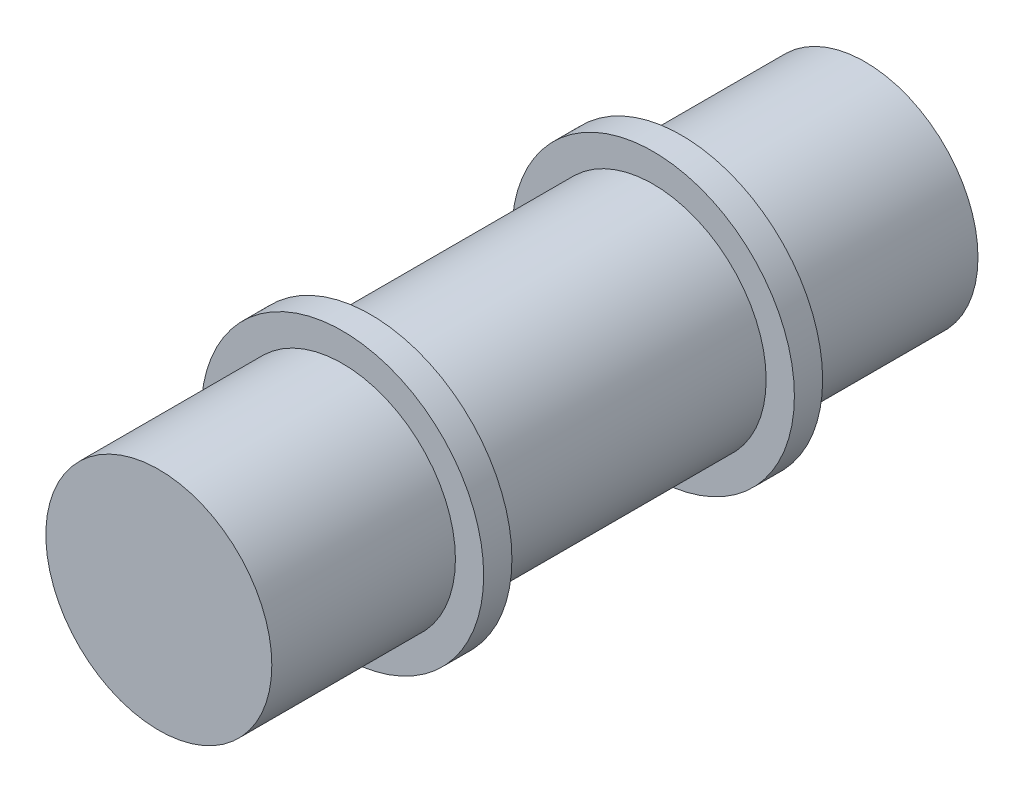
ISO-10303-21;
HEADER;
FILE_DESCRIPTION(('STEP AP214'),'2;1');
FILE_NAME('part.step','',(''),(''),'','','');
FILE_SCHEMA(('AUTOMOTIVE_DESIGN { 1 0 10303 214 1 1 1 1 }'));
ENDSEC;
DATA;
#1=APPLICATION_CONTEXT('core data for automotive mechanical design processes');
#2=APPLICATION_PROTOCOL_DEFINITION('international standard','automotive_design',2000,#1);
#3=PRODUCT_CONTEXT('',#1,'mechanical');
#4=PRODUCT('Part','Part','',(#3));
#5=PRODUCT_RELATED_PRODUCT_CATEGORY('part','',(#4));
#6=PRODUCT_DEFINITION_FORMATION('','',#4);
#7=PRODUCT_DEFINITION_CONTEXT('part definition',#1,'design');
#8=PRODUCT_DEFINITION('design','',#6,#7);
#9=PRODUCT_DEFINITION_SHAPE('','',#8);
#10=(LENGTH_UNIT() NAMED_UNIT(*) SI_UNIT(.MILLI.,.METRE.));
#11=(NAMED_UNIT(*) PLANE_ANGLE_UNIT() SI_UNIT($,.RADIAN.));
#12=(NAMED_UNIT(*) SI_UNIT($,.STERADIAN.) SOLID_ANGLE_UNIT());
#13=UNCERTAINTY_MEASURE_WITH_UNIT(LENGTH_MEASURE(1.E-05),#10,'distance_accuracy_value','');
#14=(GEOMETRIC_REPRESENTATION_CONTEXT(3) GLOBAL_UNCERTAINTY_ASSIGNED_CONTEXT((#13)) GLOBAL_UNIT_ASSIGNED_CONTEXT((#10,
#11,#12)) REPRESENTATION_CONTEXT('',''));
#15=CARTESIAN_POINT('',(0.,0.,0.));
#16=DIRECTION('',(0.,0.,1.));
#17=DIRECTION('',(1.,0.,0.));
#18=AXIS2_PLACEMENT_3D('',#15,#16,#17);
#19=CARTESIAN_POINT('',(0.,0.,15.));
#20=DIRECTION('',(0.,0.,-1.));
#21=DIRECTION('',(-1.,0.,0.));
#22=AXIS2_PLACEMENT_3D('',#19,#20,#21);
#23=PLANE('',#22);
#24=CARTESIAN_POINT('',(0.,0.,15.));
#25=DIRECTION('',(0.,0.,1.));
#26=DIRECTION('',(1.,0.,0.));
#27=AXIS2_PLACEMENT_3D('',#24,#25,#26);
#28=CIRCLE('',#27,7.99999999999999);
#29=CARTESIAN_POINT('',(7.99999999999999,0.,15.));
#30=VERTEX_POINT('',#29);
#31=EDGE_CURVE('E48',#30,#30,#28,.T.);
#32=ORIENTED_EDGE('',*,*,#31,.F.);
#33=EDGE_LOOP('',(#32));
#34=FACE_BOUND('',#33,.T.);
#35=CARTESIAN_POINT('',(0.,0.,15.));
#36=DIRECTION('',(0.,0.,1.));
#37=DIRECTION('',(1.,0.,0.));
#38=AXIS2_PLACEMENT_3D('',#35,#36,#37);
#39=CIRCLE('',#38,10.);
#40=CARTESIAN_POINT('',(10.,0.,15.));
#41=VERTEX_POINT('',#40);
#42=EDGE_CURVE('E57',#41,#41,#39,.T.);
#43=ORIENTED_EDGE('',*,*,#42,.T.);
#44=EDGE_LOOP('',(#43));
#45=FACE_BOUND('',#44,.T.);
#46=ADVANCED_FACE('F31',(#34,#45),#23,.F.);
#47=CARTESIAN_POINT('',(0.,0.,35.));
#48=DIRECTION('',(0.,0.,-1.));
#49=DIRECTION('',(-1.,0.,0.));
#50=AXIS2_PLACEMENT_3D('',#47,#48,#49);
#51=PLANE('',#50);
#52=CARTESIAN_POINT('',(0.,0.,35.));
#53=DIRECTION('',(0.,0.,1.));
#54=DIRECTION('',(1.,0.,0.));
#55=AXIS2_PLACEMENT_3D('',#52,#53,#54);
#56=CIRCLE('',#55,7.99999999999999);
#57=CARTESIAN_POINT('',(7.99999999999999,0.,35.));
#58=VERTEX_POINT('',#57);
#59=EDGE_CURVE('E51',#58,#58,#56,.T.);
#60=ORIENTED_EDGE('',*,*,#59,.T.);
#61=EDGE_LOOP('',(#60));
#62=FACE_BOUND('',#61,.T.);
#63=CARTESIAN_POINT('',(0.,0.,35.));
#64=DIRECTION('',(0.,0.,1.));
#65=DIRECTION('',(1.,0.,0.));
#66=AXIS2_PLACEMENT_3D('',#63,#64,#65);
#67=CIRCLE('',#66,10.);
#68=CARTESIAN_POINT('',(10.,0.,35.));
#69=VERTEX_POINT('',#68);
#70=EDGE_CURVE('E54',#69,#69,#67,.T.);
#71=ORIENTED_EDGE('',*,*,#70,.F.);
#72=EDGE_LOOP('',(#71));
#73=FACE_BOUND('',#72,.T.);
#74=ADVANCED_FACE('F85',(#62,#73),#51,.T.);
#75=CARTESIAN_POINT('',(0.,0.,25.));
#76=DIRECTION('',(0.,0.,1.));
#77=DIRECTION('',(1.,0.,0.));
#78=AXIS2_PLACEMENT_3D('',#75,#76,#77);
#79=CYLINDRICAL_SURFACE('',#78,7.99999999999999);
#80=ORIENTED_EDGE('',*,*,#31,.T.);
#81=EDGE_LOOP('',(#80));
#82=FACE_BOUND('',#81,.T.);
#83=ORIENTED_EDGE('',*,*,#59,.F.);
#84=EDGE_LOOP('',(#83));
#85=FACE_BOUND('',#84,.T.);
#86=ADVANCED_FACE('F91',(#82,#85),#79,.T.);
#87=CARTESIAN_POINT('',(0.,0.,50.));
#88=DIRECTION('',(0.,0.,-1.));
#89=DIRECTION('',(-1.,0.,0.));
#90=AXIS2_PLACEMENT_3D('',#87,#88,#89);
#91=CYLINDRICAL_SURFACE('',#90,10.);
#92=ORIENTED_EDGE('',*,*,#42,.F.);
#93=EDGE_LOOP('',(#92));
#94=FACE_BOUND('',#93,.T.);
#95=CARTESIAN_POINT('',(0.,0.,13.));
#96=DIRECTION('',(0.,0.,1.));
#97=DIRECTION('',(1.,0.,0.));
#98=AXIS2_PLACEMENT_3D('',#95,#96,#97);
#99=CIRCLE('',#98,10.);
#100=CARTESIAN_POINT('',(10.,0.,13.));
#101=VERTEX_POINT('',#100);
#102=EDGE_CURVE('E62',#101,#101,#99,.T.);
#103=ORIENTED_EDGE('',*,*,#102,.T.);
#104=EDGE_LOOP('',(#103));
#105=FACE_BOUND('',#104,.T.);
#106=ADVANCED_FACE('F107',(#94,#105),#91,.T.);
#107=CARTESIAN_POINT('',(0.,0.,37.));
#108=DIRECTION('',(0.,0.,1.));
#109=DIRECTION('',(1.,0.,0.));
#110=AXIS2_PLACEMENT_3D('',#107,#108,#109);
#111=CIRCLE('',#110,10.);
#112=CARTESIAN_POINT('',(10.,0.,37.));
#113=VERTEX_POINT('',#112);
#114=EDGE_CURVE('E10',#113,#113,#111,.T.);
#115=ORIENTED_EDGE('',*,*,#114,.F.);
#116=EDGE_LOOP('',(#115));
#117=FACE_BOUND('',#116,.T.);
#118=ORIENTED_EDGE('',*,*,#70,.T.);
#119=EDGE_LOOP('',(#118));
#120=FACE_BOUND('',#119,.T.);
#121=ADVANCED_FACE('F33',(#117,#120),#91,.T.);
#122=CARTESIAN_POINT('',(0.,0.,25.));
#123=DIRECTION('',(0.,0.,1.));
#124=DIRECTION('',(1.,0.,0.));
#125=AXIS2_PLACEMENT_3D('',#122,#123,#124);
#126=CYLINDRICAL_SURFACE('',#125,8.);
#127=CARTESIAN_POINT('',(0.,0.,13.));
#128=DIRECTION('',(0.,0.,1.));
#129=DIRECTION('',(1.,0.,0.));
#130=AXIS2_PLACEMENT_3D('',#127,#128,#129);
#131=CIRCLE('',#130,8.);
#132=CARTESIAN_POINT('',(8.,0.,13.));
#133=VERTEX_POINT('',#132);
#134=EDGE_CURVE('E60',#133,#133,#131,.T.);
#135=ORIENTED_EDGE('',*,*,#134,.F.);
#136=EDGE_LOOP('',(#135));
#137=FACE_BOUND('',#136,.T.);
#138=CARTESIAN_POINT('',(0.,0.,0.));
#139=DIRECTION('',(0.,0.,1.));
#140=DIRECTION('',(1.,0.,0.));
#141=AXIS2_PLACEMENT_3D('',#138,#139,#140);
#142=CIRCLE('',#141,8.);
#143=CARTESIAN_POINT('',(8.,0.,0.));
#144=VERTEX_POINT('',#143);
#145=EDGE_CURVE('E35',#144,#144,#142,.T.);
#146=ORIENTED_EDGE('',*,*,#145,.T.);
#147=EDGE_LOOP('',(#146));
#148=FACE_BOUND('',#147,.T.);
#149=ADVANCED_FACE('F69',(#137,#148),#126,.T.);
#150=CARTESIAN_POINT('',(0.,0.,13.));
#151=DIRECTION('',(0.,0.,-1.));
#152=DIRECTION('',(-1.,0.,0.));
#153=AXIS2_PLACEMENT_3D('',#150,#151,#152);
#154=PLANE('',#153);
#155=ORIENTED_EDGE('',*,*,#134,.T.);
#156=EDGE_LOOP('',(#155));
#157=FACE_BOUND('',#156,.T.);
#158=ORIENTED_EDGE('',*,*,#102,.F.);
#159=EDGE_LOOP('',(#158));
#160=FACE_BOUND('',#159,.T.);
#161=ADVANCED_FACE('F98',(#157,#160),#154,.T.);
#162=CARTESIAN_POINT('',(0.,0.,37.));
#163=DIRECTION('',(0.,0.,-1.));
#164=DIRECTION('',(-1.,0.,0.));
#165=AXIS2_PLACEMENT_3D('',#162,#163,#164);
#166=PLANE('',#165);
#167=CARTESIAN_POINT('',(0.,0.,37.));
#168=DIRECTION('',(0.,0.,1.));
#169=DIRECTION('',(1.,0.,0.));
#170=AXIS2_PLACEMENT_3D('',#167,#168,#169);
#171=CIRCLE('',#170,7.99999999999999);
#172=CARTESIAN_POINT('',(7.99999999999999,0.,37.));
#173=VERTEX_POINT('',#172);
#174=EDGE_CURVE('E44',#173,#173,#171,.T.);
#175=ORIENTED_EDGE('',*,*,#174,.F.);
#176=EDGE_LOOP('',(#175));
#177=FACE_BOUND('',#176,.T.);
#178=ORIENTED_EDGE('',*,*,#114,.T.);
#179=EDGE_LOOP('',(#178));
#180=FACE_BOUND('',#179,.T.);
#181=ADVANCED_FACE('F81',(#177,#180),#166,.F.);
#182=CARTESIAN_POINT('',(0.,0.,25.));
#183=DIRECTION('',(0.,0.,1.));
#184=DIRECTION('',(1.,0.,0.));
#185=AXIS2_PLACEMENT_3D('',#182,#183,#184);
#186=CYLINDRICAL_SURFACE('',#185,7.99999999999999);
#187=ORIENTED_EDGE('',*,*,#174,.T.);
#188=EDGE_LOOP('',(#187));
#189=FACE_BOUND('',#188,.T.);
#190=CARTESIAN_POINT('',(0.,0.,50.));
#191=DIRECTION('',(0.,0.,1.));
#192=DIRECTION('',(1.,0.,0.));
#193=AXIS2_PLACEMENT_3D('',#190,#191,#192);
#194=CIRCLE('',#193,7.99999999999999);
#195=CARTESIAN_POINT('',(7.99999999999999,0.,50.));
#196=VERTEX_POINT('',#195);
#197=EDGE_CURVE('E39',#196,#196,#194,.T.);
#198=ORIENTED_EDGE('',*,*,#197,.F.);
#199=EDGE_LOOP('',(#198));
#200=FACE_BOUND('',#199,.T.);
#201=ADVANCED_FACE('F74',(#189,#200),#186,.T.);
#202=CARTESIAN_POINT('',(0.,0.,0.));
#203=DIRECTION('',(0.,0.,1.));
#204=DIRECTION('',(1.,0.,0.));
#205=AXIS2_PLACEMENT_3D('',#202,#203,#204);
#206=PLANE('',#205);
#207=ORIENTED_EDGE('',*,*,#145,.F.);
#208=EDGE_LOOP('',(#207));
#209=FACE_BOUND('',#208,.T.);
#210=ADVANCED_FACE('F71',(#209),#206,.F.);
#211=CARTESIAN_POINT('',(0.,0.,50.));
#212=DIRECTION('',(0.,0.,1.));
#213=DIRECTION('',(1.,0.,0.));
#214=AXIS2_PLACEMENT_3D('',#211,#212,#213);
#215=PLANE('',#214);
#216=ORIENTED_EDGE('',*,*,#197,.T.);
#217=EDGE_LOOP('',(#216));
#218=FACE_BOUND('',#217,.T.);
#219=ADVANCED_FACE('F73',(#218),#215,.T.);
#220=CLOSED_SHELL('',(#46,#74,#86,#106,#121,#149,#161,#181,#201,#210,#219));
#221=MANIFOLD_SOLID_BREP('B2',#220);
#222=ADVANCED_BREP_SHAPE_REPRESENTATION('',(#18,#221),#14);
#223=SHAPE_DEFINITION_REPRESENTATION(#9,#222);
ENDSEC;
END-ISO-10303-21;
